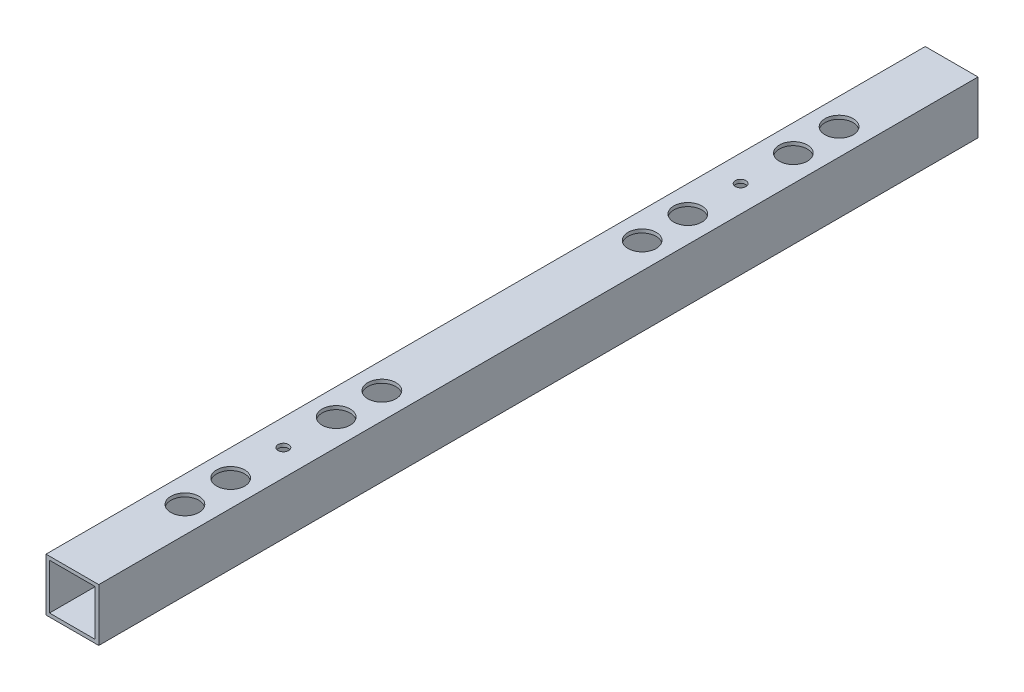
ISO-10303-21;
HEADER;
FILE_DESCRIPTION(('STEP AP214'),'2;1');
FILE_NAME('part.step','',(''),(''),'','','');
FILE_SCHEMA(('AUTOMOTIVE_DESIGN { 1 0 10303 214 1 1 1 1 }'));
ENDSEC;
DATA;
#1=APPLICATION_CONTEXT('core data for automotive mechanical design processes');
#2=APPLICATION_PROTOCOL_DEFINITION('international standard','automotive_design',2000,#1);
#3=PRODUCT_CONTEXT('',#1,'mechanical');
#4=PRODUCT('Part','Part','',(#3));
#5=PRODUCT_RELATED_PRODUCT_CATEGORY('part','',(#4));
#6=PRODUCT_DEFINITION_FORMATION('','',#4);
#7=PRODUCT_DEFINITION_CONTEXT('part definition',#1,'design');
#8=PRODUCT_DEFINITION('design','',#6,#7);
#9=PRODUCT_DEFINITION_SHAPE('','',#8);
#10=(LENGTH_UNIT() NAMED_UNIT(*) SI_UNIT(.MILLI.,.METRE.));
#11=(NAMED_UNIT(*) PLANE_ANGLE_UNIT() SI_UNIT($,.RADIAN.));
#12=(NAMED_UNIT(*) SI_UNIT($,.STERADIAN.) SOLID_ANGLE_UNIT());
#13=UNCERTAINTY_MEASURE_WITH_UNIT(LENGTH_MEASURE(1.E-05),#10,'distance_accuracy_value','');
#14=(GEOMETRIC_REPRESENTATION_CONTEXT(3) GLOBAL_UNCERTAINTY_ASSIGNED_CONTEXT((#13)) GLOBAL_UNIT_ASSIGNED_CONTEXT((#10,
#11,#12)) REPRESENTATION_CONTEXT('',''));
#15=CARTESIAN_POINT('',(0.,0.,0.));
#16=DIRECTION('',(0.,0.,1.));
#17=DIRECTION('',(1.,0.,0.));
#18=AXIS2_PLACEMENT_3D('',#15,#16,#17);
#19=CARTESIAN_POINT('',(0.,0.,250.));
#20=DIRECTION('',(0.,0.,-1.));
#21=DIRECTION('',(-1.,0.,0.));
#22=AXIS2_PLACEMENT_3D('',#19,#20,#21);
#23=PLANE('',#22);
#24=DIRECTION('',(0.,1.,0.));
#25=VECTOR('',#24,1.);
#26=CARTESIAN_POINT('',(7.5,-7.5,250.));
#27=LINE('',#26,#25);
#28=CARTESIAN_POINT('',(7.5,-7.5,250.));
#29=VERTEX_POINT('',#28);
#30=CARTESIAN_POINT('',(7.5,7.5,250.));
#31=VERTEX_POINT('',#30);
#32=EDGE_CURVE('E142',#29,#31,#27,.T.);
#33=ORIENTED_EDGE('',*,*,#32,.T.);
#34=DIRECTION('',(-1.,0.,0.));
#35=VECTOR('',#34,1.);
#36=CARTESIAN_POINT('',(-7.5,7.5,250.));
#37=LINE('',#36,#35);
#38=CARTESIAN_POINT('',(-7.5,7.5,250.));
#39=VERTEX_POINT('',#38);
#40=EDGE_CURVE('E145',#31,#39,#37,.T.);
#41=ORIENTED_EDGE('',*,*,#40,.T.);
#42=DIRECTION('',(0.,-1.,0.));
#43=VECTOR('',#42,1.);
#44=CARTESIAN_POINT('',(-7.5,-7.5,250.));
#45=LINE('',#44,#43);
#46=CARTESIAN_POINT('',(-7.5,-7.5,250.));
#47=VERTEX_POINT('',#46);
#48=EDGE_CURVE('E148',#39,#47,#45,.T.);
#49=ORIENTED_EDGE('',*,*,#48,.T.);
#50=DIRECTION('',(1.,0.,0.));
#51=VECTOR('',#50,1.);
#52=CARTESIAN_POINT('',(-7.5,-7.5,250.));
#53=LINE('',#52,#51);
#54=EDGE_CURVE('E150',#47,#29,#53,.T.);
#55=ORIENTED_EDGE('',*,*,#54,.T.);
#56=EDGE_LOOP('',(#33,#41,#49,#55));
#57=FACE_BOUND('',#56,.T.);
#58=DIRECTION('',(0.,-1.,0.));
#59=VECTOR('',#58,1.);
#60=CARTESIAN_POINT('',(-6.5,-6.5,250.));
#61=LINE('',#60,#59);
#62=CARTESIAN_POINT('',(-6.5,6.5,250.));
#63=VERTEX_POINT('',#62);
#64=CARTESIAN_POINT('',(-6.5,-6.5,250.));
#65=VERTEX_POINT('',#64);
#66=EDGE_CURVE('E104',#63,#65,#61,.T.);
#67=ORIENTED_EDGE('',*,*,#66,.F.);
#68=DIRECTION('',(-1.,0.,0.));
#69=VECTOR('',#68,1.);
#70=CARTESIAN_POINT('',(-6.5,6.5,250.));
#71=LINE('',#70,#69);
#72=CARTESIAN_POINT('',(6.5,6.5,250.));
#73=VERTEX_POINT('',#72);
#74=EDGE_CURVE('E126',#73,#63,#71,.T.);
#75=ORIENTED_EDGE('',*,*,#74,.F.);
#76=DIRECTION('',(0.,1.,0.));
#77=VECTOR('',#76,1.);
#78=CARTESIAN_POINT('',(6.5,-6.5,250.));
#79=LINE('',#78,#77);
#80=CARTESIAN_POINT('',(6.5,-6.5,250.));
#81=VERTEX_POINT('',#80);
#82=EDGE_CURVE('E124',#81,#73,#79,.T.);
#83=ORIENTED_EDGE('',*,*,#82,.F.);
#84=DIRECTION('',(1.,0.,0.));
#85=VECTOR('',#84,1.);
#86=CARTESIAN_POINT('',(-6.5,-6.5,250.));
#87=LINE('',#86,#85);
#88=EDGE_CURVE('E112',#65,#81,#87,.T.);
#89=ORIENTED_EDGE('',*,*,#88,.F.);
#90=EDGE_LOOP('',(#67,#75,#83,#89));
#91=FACE_BOUND('',#90,.T.);
#92=ADVANCED_FACE('F37',(#57,#91),#23,.F.);
#93=CARTESIAN_POINT('',(0.,0.,0.));
#94=DIRECTION('',(0.,0.,-1.));
#95=DIRECTION('',(-1.,0.,0.));
#96=AXIS2_PLACEMENT_3D('',#93,#94,#95);
#97=PLANE('',#96);
#98=DIRECTION('',(0.,1.,0.));
#99=VECTOR('',#98,1.);
#100=CARTESIAN_POINT('',(7.5,-7.5,0.));
#101=LINE('',#100,#99);
#102=CARTESIAN_POINT('',(7.5,-7.5,0.));
#103=VERTEX_POINT('',#102);
#104=CARTESIAN_POINT('',(7.5,7.5,0.));
#105=VERTEX_POINT('',#104);
#106=EDGE_CURVE('E120',#103,#105,#101,.T.);
#107=ORIENTED_EDGE('',*,*,#106,.F.);
#108=DIRECTION('',(1.,0.,0.));
#109=VECTOR('',#108,1.);
#110=CARTESIAN_POINT('',(-7.5,-7.5,0.));
#111=LINE('',#110,#109);
#112=CARTESIAN_POINT('',(-7.5,-7.5,0.));
#113=VERTEX_POINT('',#112);
#114=EDGE_CURVE('E146',#113,#103,#111,.T.);
#115=ORIENTED_EDGE('',*,*,#114,.F.);
#116=DIRECTION('',(0.,-1.,0.));
#117=VECTOR('',#116,1.);
#118=CARTESIAN_POINT('',(-7.5,-7.5,0.));
#119=LINE('',#118,#117);
#120=CARTESIAN_POINT('',(-7.5,7.5,0.));
#121=VERTEX_POINT('',#120);
#122=EDGE_CURVE('E157',#121,#113,#119,.T.);
#123=ORIENTED_EDGE('',*,*,#122,.F.);
#124=DIRECTION('',(-1.,0.,0.));
#125=VECTOR('',#124,1.);
#126=CARTESIAN_POINT('',(-7.5,7.5,0.));
#127=LINE('',#126,#125);
#128=EDGE_CURVE('E155',#105,#121,#127,.T.);
#129=ORIENTED_EDGE('',*,*,#128,.F.);
#130=EDGE_LOOP('',(#107,#115,#123,#129));
#131=FACE_BOUND('',#130,.T.);
#132=DIRECTION('',(-1.,0.,0.));
#133=VECTOR('',#132,1.);
#134=CARTESIAN_POINT('',(-6.5,6.5,0.));
#135=LINE('',#134,#133);
#136=CARTESIAN_POINT('',(6.5,6.5,0.));
#137=VERTEX_POINT('',#136);
#138=CARTESIAN_POINT('',(-6.5,6.5,0.));
#139=VERTEX_POINT('',#138);
#140=EDGE_CURVE('E113',#137,#139,#135,.T.);
#141=ORIENTED_EDGE('',*,*,#140,.T.);
#142=DIRECTION('',(0.,-1.,0.));
#143=VECTOR('',#142,1.);
#144=CARTESIAN_POINT('',(-6.5,-6.5,0.));
#145=LINE('',#144,#143);
#146=CARTESIAN_POINT('',(-6.5,-6.5,0.));
#147=VERTEX_POINT('',#146);
#148=EDGE_CURVE('E62',#139,#147,#145,.T.);
#149=ORIENTED_EDGE('',*,*,#148,.T.);
#150=DIRECTION('',(1.,0.,0.));
#151=VECTOR('',#150,1.);
#152=CARTESIAN_POINT('',(-6.5,-6.5,0.));
#153=LINE('',#152,#151);
#154=CARTESIAN_POINT('',(6.5,-6.5,0.));
#155=VERTEX_POINT('',#154);
#156=EDGE_CURVE('E119',#147,#155,#153,.T.);
#157=ORIENTED_EDGE('',*,*,#156,.T.);
#158=DIRECTION('',(0.,1.,0.));
#159=VECTOR('',#158,1.);
#160=CARTESIAN_POINT('',(6.5,-6.5,0.));
#161=LINE('',#160,#159);
#162=EDGE_CURVE('E134',#155,#137,#161,.T.);
#163=ORIENTED_EDGE('',*,*,#162,.T.);
#164=EDGE_LOOP('',(#141,#149,#157,#163));
#165=FACE_BOUND('',#164,.T.);
#166=ADVANCED_FACE('F307',(#131,#165),#97,.T.);
#167=CARTESIAN_POINT('',(7.5,-7.5,250.));
#168=DIRECTION('',(-1.,0.,0.));
#169=DIRECTION('',(0.,0.,1.));
#170=AXIS2_PLACEMENT_3D('',#167,#168,#169);
#171=PLANE('',#170);
#172=ORIENTED_EDGE('',*,*,#106,.T.);
#173=DIRECTION('',(0.,0.,-1.));
#174=VECTOR('',#173,1.);
#175=CARTESIAN_POINT('',(7.5,7.5,250.));
#176=LINE('',#175,#174);
#177=EDGE_CURVE('E11',#31,#105,#176,.T.);
#178=ORIENTED_EDGE('',*,*,#177,.F.);
#179=ORIENTED_EDGE('',*,*,#32,.F.);
#180=DIRECTION('',(0.,0.,-1.));
#181=VECTOR('',#180,1.);
#182=CARTESIAN_POINT('',(7.5,-7.5,250.));
#183=LINE('',#182,#181);
#184=EDGE_CURVE('E152',#29,#103,#183,.T.);
#185=ORIENTED_EDGE('',*,*,#184,.T.);
#186=EDGE_LOOP('',(#172,#178,#179,#185));
#187=FACE_BOUND('',#186,.T.);
#188=ADVANCED_FACE('F39',(#187),#171,.F.);
#189=CARTESIAN_POINT('',(-7.5,7.5,250.));
#190=DIRECTION('',(0.,-1.,0.));
#191=DIRECTION('',(0.,0.,-1.));
#192=AXIS2_PLACEMENT_3D('',#189,#190,#191);
#193=PLANE('',#192);
#194=CARTESIAN_POINT('',(0.,7.5,205.));
#195=DIRECTION('',(0.,1.,0.));
#196=DIRECTION('',(0.,0.,1.));
#197=AXIS2_PLACEMENT_3D('',#194,#195,#196);
#198=CIRCLE('',#197,4.);
#199=CARTESIAN_POINT('',(0.,7.5,209.));
#200=VERTEX_POINT('',#199);
#201=EDGE_CURVE('E186',#200,#200,#198,.T.);
#202=ORIENTED_EDGE('',*,*,#201,.F.);
#203=EDGE_LOOP('',(#202));
#204=FACE_BOUND('',#203,.T.);
#205=CARTESIAN_POINT('',(0.,7.5,162.));
#206=DIRECTION('',(0.,1.,0.));
#207=DIRECTION('',(0.,0.,1.));
#208=AXIS2_PLACEMENT_3D('',#205,#206,#207);
#209=CIRCLE('',#208,4.);
#210=CARTESIAN_POINT('',(0.,7.5,166.));
#211=VERTEX_POINT('',#210);
#212=EDGE_CURVE('E222',#211,#211,#209,.T.);
#213=ORIENTED_EDGE('',*,*,#212,.F.);
#214=EDGE_LOOP('',(#213));
#215=FACE_BOUND('',#214,.T.);
#216=CARTESIAN_POINT('',(0.,7.5,175.));
#217=DIRECTION('',(0.,1.,0.));
#218=DIRECTION('',(0.,0.,1.));
#219=AXIS2_PLACEMENT_3D('',#216,#217,#218);
#220=CIRCLE('',#219,4.);
#221=CARTESIAN_POINT('',(0.,7.5,179.));
#222=VERTEX_POINT('',#221);
#223=EDGE_CURVE('E225',#222,#222,#220,.T.);
#224=ORIENTED_EDGE('',*,*,#223,.F.);
#225=EDGE_LOOP('',(#224));
#226=FACE_BOUND('',#225,.T.);
#227=CARTESIAN_POINT('',(0.,7.5,75.));
#228=DIRECTION('',(0.,1.,0.));
#229=DIRECTION('',(0.,0.,-1.));
#230=AXIS2_PLACEMENT_3D('',#227,#228,#229);
#231=CIRCLE('',#230,4.);
#232=CARTESIAN_POINT('',(0.,7.5,71.));
#233=VERTEX_POINT('',#232);
#234=EDGE_CURVE('E228',#233,#233,#231,.T.);
#235=ORIENTED_EDGE('',*,*,#234,.F.);
#236=EDGE_LOOP('',(#235));
#237=FACE_BOUND('',#236,.T.);
#238=CARTESIAN_POINT('',(0.,7.5,88.));
#239=DIRECTION('',(0.,1.,0.));
#240=DIRECTION('',(0.,0.,-1.));
#241=AXIS2_PLACEMENT_3D('',#238,#239,#240);
#242=CIRCLE('',#241,4.);
#243=CARTESIAN_POINT('',(0.,7.5,84.));
#244=VERTEX_POINT('',#243);
#245=EDGE_CURVE('E231',#244,#244,#242,.T.);
#246=ORIENTED_EDGE('',*,*,#245,.F.);
#247=EDGE_LOOP('',(#246));
#248=FACE_BOUND('',#247,.T.);
#249=CARTESIAN_POINT('',(0.,7.5,45.));
#250=DIRECTION('',(0.,1.,0.));
#251=DIRECTION('',(0.,0.,-1.));
#252=AXIS2_PLACEMENT_3D('',#249,#250,#251);
#253=CIRCLE('',#252,4.);
#254=CARTESIAN_POINT('',(0.,7.5,41.));
#255=VERTEX_POINT('',#254);
#256=EDGE_CURVE('E210',#255,#255,#253,.T.);
#257=ORIENTED_EDGE('',*,*,#256,.F.);
#258=EDGE_LOOP('',(#257));
#259=FACE_BOUND('',#258,.T.);
#260=CARTESIAN_POINT('',(0.,7.5,32.));
#261=DIRECTION('',(0.,1.,0.));
#262=DIRECTION('',(0.,0.,-1.));
#263=AXIS2_PLACEMENT_3D('',#260,#261,#262);
#264=CIRCLE('',#263,4.);
#265=CARTESIAN_POINT('',(0.,7.5,28.));
#266=VERTEX_POINT('',#265);
#267=EDGE_CURVE('E205',#266,#266,#264,.T.);
#268=ORIENTED_EDGE('',*,*,#267,.F.);
#269=EDGE_LOOP('',(#268));
#270=FACE_BOUND('',#269,.T.);
#271=CARTESIAN_POINT('',(0.,7.5,218.));
#272=DIRECTION('',(0.,1.,0.));
#273=DIRECTION('',(0.,0.,1.));
#274=AXIS2_PLACEMENT_3D('',#271,#272,#273);
#275=CIRCLE('',#274,4.);
#276=CARTESIAN_POINT('',(0.,7.5,222.));
#277=VERTEX_POINT('',#276);
#278=EDGE_CURVE('E181',#277,#277,#275,.T.);
#279=ORIENTED_EDGE('',*,*,#278,.F.);
#280=EDGE_LOOP('',(#279));
#281=FACE_BOUND('',#280,.T.);
#282=CARTESIAN_POINT('',(0.,7.5,190.));
#283=DIRECTION('',(0.,1.,0.));
#284=DIRECTION('',(0.,0.,1.));
#285=AXIS2_PLACEMENT_3D('',#282,#283,#284);
#286=CIRCLE('',#285,1.5);
#287=CARTESIAN_POINT('',(0.,7.5,191.5));
#288=VERTEX_POINT('',#287);
#289=EDGE_CURVE('E171',#288,#288,#286,.T.);
#290=ORIENTED_EDGE('',*,*,#289,.F.);
#291=EDGE_LOOP('',(#290));
#292=FACE_BOUND('',#291,.T.);
#293=CARTESIAN_POINT('',(0.,7.5,60.));
#294=DIRECTION('',(0.,1.,0.));
#295=DIRECTION('',(0.,0.,-1.));
#296=AXIS2_PLACEMENT_3D('',#293,#294,#295);
#297=CIRCLE('',#296,1.5);
#298=CARTESIAN_POINT('',(0.,7.5,58.5));
#299=VERTEX_POINT('',#298);
#300=EDGE_CURVE('E180',#299,#299,#297,.T.);
#301=ORIENTED_EDGE('',*,*,#300,.F.);
#302=EDGE_LOOP('',(#301));
#303=FACE_BOUND('',#302,.T.);
#304=ORIENTED_EDGE('',*,*,#128,.T.);
#305=DIRECTION('',(0.,0.,-1.));
#306=VECTOR('',#305,1.);
#307=CARTESIAN_POINT('',(-7.5,7.5,250.));
#308=LINE('',#307,#306);
#309=EDGE_CURVE('E46',#39,#121,#308,.T.);
#310=ORIENTED_EDGE('',*,*,#309,.F.);
#311=ORIENTED_EDGE('',*,*,#40,.F.);
#312=ORIENTED_EDGE('',*,*,#177,.T.);
#313=EDGE_LOOP('',(#304,#310,#311,#312));
#314=FACE_BOUND('',#313,.T.);
#315=ADVANCED_FACE('F323',(#204,#215,#226,#237,#248,#259,#270,#281,#292,#303,#314),#193,.F.);
#316=CARTESIAN_POINT('',(-7.5,-7.5,250.));
#317=DIRECTION('',(1.,0.,0.));
#318=DIRECTION('',(0.,0.,-1.));
#319=AXIS2_PLACEMENT_3D('',#316,#317,#318);
#320=PLANE('',#319);
#321=ORIENTED_EDGE('',*,*,#122,.T.);
#322=DIRECTION('',(0.,0.,-1.));
#323=VECTOR('',#322,1.);
#324=CARTESIAN_POINT('',(-7.5,-7.5,250.));
#325=LINE('',#324,#323);
#326=EDGE_CURVE('E162',#47,#113,#325,.T.);
#327=ORIENTED_EDGE('',*,*,#326,.F.);
#328=ORIENTED_EDGE('',*,*,#48,.F.);
#329=ORIENTED_EDGE('',*,*,#309,.T.);
#330=EDGE_LOOP('',(#321,#327,#328,#329));
#331=FACE_BOUND('',#330,.T.);
#332=ADVANCED_FACE('F320',(#331),#320,.F.);
#333=CARTESIAN_POINT('',(-7.5,-7.5,250.));
#334=DIRECTION('',(0.,1.,0.));
#335=DIRECTION('',(0.,0.,1.));
#336=AXIS2_PLACEMENT_3D('',#333,#334,#335);
#337=PLANE('',#336);
#338=CARTESIAN_POINT('',(0.,-7.5,190.));
#339=DIRECTION('',(0.,-1.,0.));
#340=DIRECTION('',(0.,0.,-1.));
#341=AXIS2_PLACEMENT_3D('',#338,#339,#340);
#342=CIRCLE('',#341,4.);
#343=CARTESIAN_POINT('',(0.,-7.5,186.));
#344=VERTEX_POINT('',#343);
#345=EDGE_CURVE('E217',#344,#344,#342,.T.);
#346=ORIENTED_EDGE('',*,*,#345,.F.);
#347=EDGE_LOOP('',(#346));
#348=FACE_BOUND('',#347,.T.);
#349=CARTESIAN_POINT('',(0.,-7.5,60.));
#350=DIRECTION('',(0.,-1.,0.));
#351=DIRECTION('',(0.,0.,-1.));
#352=AXIS2_PLACEMENT_3D('',#349,#350,#351);
#353=CIRCLE('',#352,4.);
#354=CARTESIAN_POINT('',(0.,-7.5,56.));
#355=VERTEX_POINT('',#354);
#356=EDGE_CURVE('E206',#355,#355,#353,.T.);
#357=ORIENTED_EDGE('',*,*,#356,.F.);
#358=EDGE_LOOP('',(#357));
#359=FACE_BOUND('',#358,.T.);
#360=CARTESIAN_POINT('',(0.,-7.50000000000001,162.));
#361=DIRECTION('',(0.,1.,0.));
#362=DIRECTION('',(0.,0.,1.));
#363=AXIS2_PLACEMENT_3D('',#360,#361,#362);
#364=CIRCLE('',#363,1.5);
#365=CARTESIAN_POINT('',(0.,-7.50000000000001,163.5));
#366=VERTEX_POINT('',#365);
#367=EDGE_CURVE('E176',#366,#366,#364,.T.);
#368=ORIENTED_EDGE('',*,*,#367,.T.);
#369=EDGE_LOOP('',(#368));
#370=FACE_BOUND('',#369,.T.);
#371=CARTESIAN_POINT('',(0.,-7.50000000000001,175.));
#372=DIRECTION('',(0.,1.,0.));
#373=DIRECTION('',(0.,0.,1.));
#374=AXIS2_PLACEMENT_3D('',#371,#372,#373);
#375=CIRCLE('',#374,1.5);
#376=CARTESIAN_POINT('',(0.,-7.50000000000001,176.5));
#377=VERTEX_POINT('',#376);
#378=EDGE_CURVE('E274',#377,#377,#375,.T.);
#379=ORIENTED_EDGE('',*,*,#378,.T.);
#380=EDGE_LOOP('',(#379));
#381=FACE_BOUND('',#380,.T.);
#382=CARTESIAN_POINT('',(0.,-7.50000000000001,205.));
#383=DIRECTION('',(0.,1.,0.));
#384=DIRECTION('',(0.,0.,1.));
#385=AXIS2_PLACEMENT_3D('',#382,#383,#384);
#386=CIRCLE('',#385,1.5);
#387=CARTESIAN_POINT('',(0.,-7.50000000000001,206.5));
#388=VERTEX_POINT('',#387);
#389=EDGE_CURVE('E268',#388,#388,#386,.T.);
#390=ORIENTED_EDGE('',*,*,#389,.T.);
#391=EDGE_LOOP('',(#390));
#392=FACE_BOUND('',#391,.T.);
#393=CARTESIAN_POINT('',(0.,-7.50000000000001,32.));
#394=DIRECTION('',(0.,1.,0.));
#395=DIRECTION('',(0.,0.,1.));
#396=AXIS2_PLACEMENT_3D('',#393,#394,#395);
#397=CIRCLE('',#396,1.5);
#398=CARTESIAN_POINT('',(0.,-7.50000000000001,33.5));
#399=VERTEX_POINT('',#398);
#400=EDGE_CURVE('E262',#399,#399,#397,.T.);
#401=ORIENTED_EDGE('',*,*,#400,.T.);
#402=EDGE_LOOP('',(#401));
#403=FACE_BOUND('',#402,.T.);
#404=CARTESIAN_POINT('',(0.,-7.50000000000001,45.));
#405=DIRECTION('',(0.,1.,0.));
#406=DIRECTION('',(0.,0.,1.));
#407=AXIS2_PLACEMENT_3D('',#404,#405,#406);
#408=CIRCLE('',#407,1.5);
#409=CARTESIAN_POINT('',(0.,-7.50000000000001,46.5));
#410=VERTEX_POINT('',#409);
#411=EDGE_CURVE('E256',#410,#410,#408,.T.);
#412=ORIENTED_EDGE('',*,*,#411,.T.);
#413=EDGE_LOOP('',(#412));
#414=FACE_BOUND('',#413,.T.);
#415=CARTESIAN_POINT('',(0.,-7.50000000000001,75.));
#416=DIRECTION('',(0.,1.,0.));
#417=DIRECTION('',(0.,0.,1.));
#418=AXIS2_PLACEMENT_3D('',#415,#416,#417);
#419=CIRCLE('',#418,1.5);
#420=CARTESIAN_POINT('',(0.,-7.50000000000001,76.5));
#421=VERTEX_POINT('',#420);
#422=EDGE_CURVE('E250',#421,#421,#419,.T.);
#423=ORIENTED_EDGE('',*,*,#422,.T.);
#424=EDGE_LOOP('',(#423));
#425=FACE_BOUND('',#424,.T.);
#426=CARTESIAN_POINT('',(0.,-7.50000000000001,88.));
#427=DIRECTION('',(0.,1.,0.));
#428=DIRECTION('',(0.,0.,1.));
#429=AXIS2_PLACEMENT_3D('',#426,#427,#428);
#430=CIRCLE('',#429,1.5);
#431=CARTESIAN_POINT('',(0.,-7.50000000000001,89.5));
#432=VERTEX_POINT('',#431);
#433=EDGE_CURVE('E244',#432,#432,#430,.T.);
#434=ORIENTED_EDGE('',*,*,#433,.T.);
#435=EDGE_LOOP('',(#434));
#436=FACE_BOUND('',#435,.T.);
#437=CARTESIAN_POINT('',(0.,-7.50000000000001,218.));
#438=DIRECTION('',(0.,1.,0.));
#439=DIRECTION('',(0.,0.,1.));
#440=AXIS2_PLACEMENT_3D('',#437,#438,#439);
#441=CIRCLE('',#440,1.5);
#442=CARTESIAN_POINT('',(0.,-7.50000000000001,219.5));
#443=VERTEX_POINT('',#442);
#444=EDGE_CURVE('E132',#443,#443,#441,.T.);
#445=ORIENTED_EDGE('',*,*,#444,.T.);
#446=EDGE_LOOP('',(#445));
#447=FACE_BOUND('',#446,.T.);
#448=ORIENTED_EDGE('',*,*,#114,.T.);
#449=ORIENTED_EDGE('',*,*,#184,.F.);
#450=ORIENTED_EDGE('',*,*,#54,.F.);
#451=ORIENTED_EDGE('',*,*,#326,.T.);
#452=EDGE_LOOP('',(#448,#449,#450,#451));
#453=FACE_BOUND('',#452,.T.);
#454=ADVANCED_FACE('F286',(#348,#359,#370,#381,#392,#403,#414,#425,#436,#447,#453),#337,.F.);
#455=CARTESIAN_POINT('',(-6.5,-6.5,250.));
#456=DIRECTION('',(1.,0.,0.));
#457=DIRECTION('',(0.,0.,-1.));
#458=AXIS2_PLACEMENT_3D('',#455,#456,#457);
#459=PLANE('',#458);
#460=ORIENTED_EDGE('',*,*,#148,.F.);
#461=DIRECTION('',(0.,0.,-1.));
#462=VECTOR('',#461,1.);
#463=CARTESIAN_POINT('',(-6.5,6.5,250.));
#464=LINE('',#463,#462);
#465=EDGE_CURVE('E108',#63,#139,#464,.T.);
#466=ORIENTED_EDGE('',*,*,#465,.F.);
#467=ORIENTED_EDGE('',*,*,#66,.T.);
#468=DIRECTION('',(0.,0.,-1.));
#469=VECTOR('',#468,1.);
#470=CARTESIAN_POINT('',(-6.5,-6.5,250.));
#471=LINE('',#470,#469);
#472=EDGE_CURVE('E107',#65,#147,#471,.T.);
#473=ORIENTED_EDGE('',*,*,#472,.T.);
#474=EDGE_LOOP('',(#460,#466,#467,#473));
#475=FACE_BOUND('',#474,.T.);
#476=ADVANCED_FACE('F106',(#475),#459,.T.);
#477=CARTESIAN_POINT('',(-6.5,-6.5,250.));
#478=DIRECTION('',(0.,1.,0.));
#479=DIRECTION('',(0.,0.,1.));
#480=AXIS2_PLACEMENT_3D('',#477,#478,#479);
#481=PLANE('',#480);
#482=CARTESIAN_POINT('',(0.,-6.5,190.));
#483=DIRECTION('',(0.,1.,0.));
#484=DIRECTION('',(0.,0.,1.));
#485=AXIS2_PLACEMENT_3D('',#482,#483,#484);
#486=CIRCLE('',#485,4.);
#487=CARTESIAN_POINT('',(0.,-6.5,194.));
#488=VERTEX_POINT('',#487);
#489=EDGE_CURVE('E41',#488,#488,#486,.T.);
#490=ORIENTED_EDGE('',*,*,#489,.F.);
#491=EDGE_LOOP('',(#490));
#492=FACE_BOUND('',#491,.T.);
#493=CARTESIAN_POINT('',(0.,-6.5,60.));
#494=DIRECTION('',(0.,1.,0.));
#495=DIRECTION('',(0.,0.,1.));
#496=AXIS2_PLACEMENT_3D('',#493,#494,#495);
#497=CIRCLE('',#496,4.);
#498=CARTESIAN_POINT('',(0.,-6.5,64.));
#499=VERTEX_POINT('',#498);
#500=EDGE_CURVE('E203',#499,#499,#497,.T.);
#501=ORIENTED_EDGE('',*,*,#500,.F.);
#502=EDGE_LOOP('',(#501));
#503=FACE_BOUND('',#502,.T.);
#504=CARTESIAN_POINT('',(0.,-6.50000000000001,162.));
#505=DIRECTION('',(0.,1.,0.));
#506=DIRECTION('',(0.,0.,1.));
#507=AXIS2_PLACEMENT_3D('',#504,#505,#506);
#508=CIRCLE('',#507,1.5);
#509=CARTESIAN_POINT('',(0.,-6.50000000000001,163.5));
#510=VERTEX_POINT('',#509);
#511=EDGE_CURVE('E277',#510,#510,#508,.T.);
#512=ORIENTED_EDGE('',*,*,#511,.F.);
#513=EDGE_LOOP('',(#512));
#514=FACE_BOUND('',#513,.T.);
#515=CARTESIAN_POINT('',(0.,-6.50000000000001,175.));
#516=DIRECTION('',(0.,1.,0.));
#517=DIRECTION('',(0.,0.,1.));
#518=AXIS2_PLACEMENT_3D('',#515,#516,#517);
#519=CIRCLE('',#518,1.5);
#520=CARTESIAN_POINT('',(0.,-6.50000000000001,176.5));
#521=VERTEX_POINT('',#520);
#522=EDGE_CURVE('E271',#521,#521,#519,.T.);
#523=ORIENTED_EDGE('',*,*,#522,.F.);
#524=EDGE_LOOP('',(#523));
#525=FACE_BOUND('',#524,.T.);
#526=CARTESIAN_POINT('',(0.,-6.50000000000001,205.));
#527=DIRECTION('',(0.,1.,0.));
#528=DIRECTION('',(0.,0.,1.));
#529=AXIS2_PLACEMENT_3D('',#526,#527,#528);
#530=CIRCLE('',#529,1.5);
#531=CARTESIAN_POINT('',(0.,-6.50000000000001,206.5));
#532=VERTEX_POINT('',#531);
#533=EDGE_CURVE('E265',#532,#532,#530,.T.);
#534=ORIENTED_EDGE('',*,*,#533,.F.);
#535=EDGE_LOOP('',(#534));
#536=FACE_BOUND('',#535,.T.);
#537=CARTESIAN_POINT('',(0.,-6.50000000000001,32.));
#538=DIRECTION('',(0.,1.,0.));
#539=DIRECTION('',(0.,0.,1.));
#540=AXIS2_PLACEMENT_3D('',#537,#538,#539);
#541=CIRCLE('',#540,1.5);
#542=CARTESIAN_POINT('',(0.,-6.50000000000001,33.5));
#543=VERTEX_POINT('',#542);
#544=EDGE_CURVE('E259',#543,#543,#541,.T.);
#545=ORIENTED_EDGE('',*,*,#544,.F.);
#546=EDGE_LOOP('',(#545));
#547=FACE_BOUND('',#546,.T.);
#548=CARTESIAN_POINT('',(0.,-6.50000000000001,45.));
#549=DIRECTION('',(0.,1.,0.));
#550=DIRECTION('',(0.,0.,1.));
#551=AXIS2_PLACEMENT_3D('',#548,#549,#550);
#552=CIRCLE('',#551,1.5);
#553=CARTESIAN_POINT('',(0.,-6.50000000000001,46.5));
#554=VERTEX_POINT('',#553);
#555=EDGE_CURVE('E253',#554,#554,#552,.T.);
#556=ORIENTED_EDGE('',*,*,#555,.F.);
#557=EDGE_LOOP('',(#556));
#558=FACE_BOUND('',#557,.T.);
#559=CARTESIAN_POINT('',(0.,-6.50000000000001,75.));
#560=DIRECTION('',(0.,1.,0.));
#561=DIRECTION('',(0.,0.,1.));
#562=AXIS2_PLACEMENT_3D('',#559,#560,#561);
#563=CIRCLE('',#562,1.5);
#564=CARTESIAN_POINT('',(0.,-6.50000000000001,76.5));
#565=VERTEX_POINT('',#564);
#566=EDGE_CURVE('E247',#565,#565,#563,.T.);
#567=ORIENTED_EDGE('',*,*,#566,.F.);
#568=EDGE_LOOP('',(#567));
#569=FACE_BOUND('',#568,.T.);
#570=CARTESIAN_POINT('',(0.,-6.50000000000001,88.));
#571=DIRECTION('',(0.,1.,0.));
#572=DIRECTION('',(0.,0.,1.));
#573=AXIS2_PLACEMENT_3D('',#570,#571,#572);
#574=CIRCLE('',#573,1.5);
#575=CARTESIAN_POINT('',(0.,-6.50000000000001,89.5));
#576=VERTEX_POINT('',#575);
#577=EDGE_CURVE('E170',#576,#576,#574,.T.);
#578=ORIENTED_EDGE('',*,*,#577,.F.);
#579=EDGE_LOOP('',(#578));
#580=FACE_BOUND('',#579,.T.);
#581=CARTESIAN_POINT('',(0.,-6.50000000000001,218.));
#582=DIRECTION('',(0.,1.,0.));
#583=DIRECTION('',(0.,0.,1.));
#584=AXIS2_PLACEMENT_3D('',#581,#582,#583);
#585=CIRCLE('',#584,1.5);
#586=CARTESIAN_POINT('',(0.,-6.50000000000001,219.5));
#587=VERTEX_POINT('',#586);
#588=EDGE_CURVE('E175',#587,#587,#585,.T.);
#589=ORIENTED_EDGE('',*,*,#588,.F.);
#590=EDGE_LOOP('',(#589));
#591=FACE_BOUND('',#590,.T.);
#592=ORIENTED_EDGE('',*,*,#156,.F.);
#593=ORIENTED_EDGE('',*,*,#472,.F.);
#594=ORIENTED_EDGE('',*,*,#88,.T.);
#595=DIRECTION('',(0.,0.,-1.));
#596=VECTOR('',#595,1.);
#597=CARTESIAN_POINT('',(6.5,-6.5,250.));
#598=LINE('',#597,#596);
#599=EDGE_CURVE('E121',#81,#155,#598,.T.);
#600=ORIENTED_EDGE('',*,*,#599,.T.);
#601=EDGE_LOOP('',(#592,#593,#594,#600));
#602=FACE_BOUND('',#601,.T.);
#603=ADVANCED_FACE('F116',(#492,#503,#514,#525,#536,#547,#558,#569,#580,#591,#602),#481,.T.);
#604=CARTESIAN_POINT('',(6.5,-6.5,250.));
#605=DIRECTION('',(-1.,0.,0.));
#606=DIRECTION('',(0.,-1.,0.));
#607=AXIS2_PLACEMENT_3D('',#604,#605,#606);
#608=PLANE('',#607);
#609=ORIENTED_EDGE('',*,*,#162,.F.);
#610=ORIENTED_EDGE('',*,*,#599,.F.);
#611=ORIENTED_EDGE('',*,*,#82,.T.);
#612=DIRECTION('',(0.,0.,-1.));
#613=VECTOR('',#612,1.);
#614=CARTESIAN_POINT('',(6.5,6.5,250.));
#615=LINE('',#614,#613);
#616=EDGE_CURVE('E54',#73,#137,#615,.T.);
#617=ORIENTED_EDGE('',*,*,#616,.T.);
#618=EDGE_LOOP('',(#609,#610,#611,#617));
#619=FACE_BOUND('',#618,.T.);
#620=ADVANCED_FACE('F302',(#619),#608,.T.);
#621=CARTESIAN_POINT('',(-6.5,6.5,250.));
#622=DIRECTION('',(0.,-1.,0.));
#623=DIRECTION('',(1.,0.,0.));
#624=AXIS2_PLACEMENT_3D('',#621,#622,#623);
#625=PLANE('',#624);
#626=CARTESIAN_POINT('',(0.,6.5,205.));
#627=DIRECTION('',(0.,-1.,0.));
#628=DIRECTION('',(1.,0.,0.));
#629=AXIS2_PLACEMENT_3D('',#626,#627,#628);
#630=CIRCLE('',#629,4.);
#631=CARTESIAN_POINT('',(4.00000000000001,6.5,205.));
#632=VERTEX_POINT('',#631);
#633=EDGE_CURVE('E201',#632,#632,#630,.T.);
#634=ORIENTED_EDGE('',*,*,#633,.F.);
#635=EDGE_LOOP('',(#634));
#636=FACE_BOUND('',#635,.T.);
#637=CARTESIAN_POINT('',(0.,6.5,162.));
#638=DIRECTION('',(0.,-1.,0.));
#639=DIRECTION('',(1.,0.,0.));
#640=AXIS2_PLACEMENT_3D('',#637,#638,#639);
#641=CIRCLE('',#640,4.);
#642=CARTESIAN_POINT('',(4.00000000000001,6.5,162.));
#643=VERTEX_POINT('',#642);
#644=EDGE_CURVE('E198',#643,#643,#641,.T.);
#645=ORIENTED_EDGE('',*,*,#644,.F.);
#646=EDGE_LOOP('',(#645));
#647=FACE_BOUND('',#646,.T.);
#648=CARTESIAN_POINT('',(0.,6.5,175.));
#649=DIRECTION('',(0.,-1.,0.));
#650=DIRECTION('',(1.,0.,0.));
#651=AXIS2_PLACEMENT_3D('',#648,#649,#650);
#652=CIRCLE('',#651,4.);
#653=CARTESIAN_POINT('',(4.00000000000001,6.5,175.));
#654=VERTEX_POINT('',#653);
#655=EDGE_CURVE('E195',#654,#654,#652,.T.);
#656=ORIENTED_EDGE('',*,*,#655,.F.);
#657=EDGE_LOOP('',(#656));
#658=FACE_BOUND('',#657,.T.);
#659=CARTESIAN_POINT('',(0.,6.5,75.));
#660=DIRECTION('',(0.,-1.,0.));
#661=DIRECTION('',(1.,0.,0.));
#662=AXIS2_PLACEMENT_3D('',#659,#660,#661);
#663=CIRCLE('',#662,4.);
#664=CARTESIAN_POINT('',(4.00000000000001,6.5,75.));
#665=VERTEX_POINT('',#664);
#666=EDGE_CURVE('E192',#665,#665,#663,.T.);
#667=ORIENTED_EDGE('',*,*,#666,.F.);
#668=EDGE_LOOP('',(#667));
#669=FACE_BOUND('',#668,.T.);
#670=CARTESIAN_POINT('',(0.,6.5,88.));
#671=DIRECTION('',(0.,-1.,0.));
#672=DIRECTION('',(1.,0.,0.));
#673=AXIS2_PLACEMENT_3D('',#670,#671,#672);
#674=CIRCLE('',#673,4.);
#675=CARTESIAN_POINT('',(4.00000000000001,6.5,88.));
#676=VERTEX_POINT('',#675);
#677=EDGE_CURVE('E189',#676,#676,#674,.T.);
#678=ORIENTED_EDGE('',*,*,#677,.F.);
#679=EDGE_LOOP('',(#678));
#680=FACE_BOUND('',#679,.T.);
#681=CARTESIAN_POINT('',(0.,6.5,45.));
#682=DIRECTION('',(0.,-1.,0.));
#683=DIRECTION('',(1.,0.,0.));
#684=AXIS2_PLACEMENT_3D('',#681,#682,#683);
#685=CIRCLE('',#684,4.);
#686=CARTESIAN_POINT('',(4.00000000000001,6.5,45.));
#687=VERTEX_POINT('',#686);
#688=EDGE_CURVE('E185',#687,#687,#685,.T.);
#689=ORIENTED_EDGE('',*,*,#688,.F.);
#690=EDGE_LOOP('',(#689));
#691=FACE_BOUND('',#690,.T.);
#692=CARTESIAN_POINT('',(0.,6.5,32.));
#693=DIRECTION('',(0.,-1.,0.));
#694=DIRECTION('',(1.,0.,0.));
#695=AXIS2_PLACEMENT_3D('',#692,#693,#694);
#696=CIRCLE('',#695,4.);
#697=CARTESIAN_POINT('',(4.,6.5,32.));
#698=VERTEX_POINT('',#697);
#699=EDGE_CURVE('E182',#698,#698,#696,.T.);
#700=ORIENTED_EDGE('',*,*,#699,.F.);
#701=EDGE_LOOP('',(#700));
#702=FACE_BOUND('',#701,.T.);
#703=CARTESIAN_POINT('',(0.,6.5,218.));
#704=DIRECTION('',(0.,-1.,0.));
#705=DIRECTION('',(1.,0.,0.));
#706=AXIS2_PLACEMENT_3D('',#703,#704,#705);
#707=CIRCLE('',#706,4.);
#708=CARTESIAN_POINT('',(4.00000000000001,6.5,218.));
#709=VERTEX_POINT('',#708);
#710=EDGE_CURVE('E177',#709,#709,#707,.T.);
#711=ORIENTED_EDGE('',*,*,#710,.F.);
#712=EDGE_LOOP('',(#711));
#713=FACE_BOUND('',#712,.T.);
#714=CARTESIAN_POINT('',(0.,6.50000000000001,190.));
#715=DIRECTION('',(0.,-1.,0.));
#716=DIRECTION('',(1.,0.,0.));
#717=AXIS2_PLACEMENT_3D('',#714,#715,#716);
#718=CIRCLE('',#717,1.5);
#719=CARTESIAN_POINT('',(1.50000000000001,6.50000000000001,190.));
#720=VERTEX_POINT('',#719);
#721=EDGE_CURVE('E172',#720,#720,#718,.T.);
#722=ORIENTED_EDGE('',*,*,#721,.F.);
#723=EDGE_LOOP('',(#722));
#724=FACE_BOUND('',#723,.T.);
#725=CARTESIAN_POINT('',(0.,6.50000000000001,60.));
#726=DIRECTION('',(0.,-1.,0.));
#727=DIRECTION('',(1.,0.,0.));
#728=AXIS2_PLACEMENT_3D('',#725,#726,#727);
#729=CIRCLE('',#728,1.5);
#730=CARTESIAN_POINT('',(1.50000000000001,6.50000000000001,60.));
#731=VERTEX_POINT('',#730);
#732=EDGE_CURVE('E167',#731,#731,#729,.T.);
#733=ORIENTED_EDGE('',*,*,#732,.F.);
#734=EDGE_LOOP('',(#733));
#735=FACE_BOUND('',#734,.T.);
#736=ORIENTED_EDGE('',*,*,#140,.F.);
#737=ORIENTED_EDGE('',*,*,#616,.F.);
#738=ORIENTED_EDGE('',*,*,#74,.T.);
#739=ORIENTED_EDGE('',*,*,#465,.T.);
#740=EDGE_LOOP('',(#736,#737,#738,#739));
#741=FACE_BOUND('',#740,.T.);
#742=ADVANCED_FACE('F292',(#636,#647,#658,#669,#680,#691,#702,#713,#724,#735,#741),#625,.T.);
#743=CARTESIAN_POINT('',(0.,-242.5,218.));
#744=DIRECTION('',(0.,1.,0.));
#745=DIRECTION('',(0.,0.,1.));
#746=AXIS2_PLACEMENT_3D('',#743,#744,#745);
#747=CYLINDRICAL_SURFACE('',#746,1.5);
#748=ORIENTED_EDGE('',*,*,#588,.T.);
#749=EDGE_LOOP('',(#748));
#750=FACE_BOUND('',#749,.T.);
#751=ORIENTED_EDGE('',*,*,#444,.F.);
#752=EDGE_LOOP('',(#751));
#753=FACE_BOUND('',#752,.T.);
#754=ADVANCED_FACE('F289',(#750,#753),#747,.F.);
#755=CARTESIAN_POINT('',(0.,-242.5,60.));
#756=DIRECTION('',(0.,1.,0.));
#757=DIRECTION('',(0.,0.,1.));
#758=AXIS2_PLACEMENT_3D('',#755,#756,#757);
#759=CYLINDRICAL_SURFACE('',#758,1.5);
#760=ORIENTED_EDGE('',*,*,#732,.T.);
#761=EDGE_LOOP('',(#760));
#762=FACE_BOUND('',#761,.T.);
#763=ORIENTED_EDGE('',*,*,#300,.T.);
#764=EDGE_LOOP('',(#763));
#765=FACE_BOUND('',#764,.T.);
#766=ADVANCED_FACE('F291',(#762,#765),#759,.F.);
#767=CARTESIAN_POINT('',(0.,-242.5,190.));
#768=DIRECTION('',(0.,1.,0.));
#769=DIRECTION('',(0.,0.,1.));
#770=AXIS2_PLACEMENT_3D('',#767,#768,#769);
#771=CYLINDRICAL_SURFACE('',#770,1.5);
#772=ORIENTED_EDGE('',*,*,#721,.T.);
#773=EDGE_LOOP('',(#772));
#774=FACE_BOUND('',#773,.T.);
#775=ORIENTED_EDGE('',*,*,#289,.T.);
#776=EDGE_LOOP('',(#775));
#777=FACE_BOUND('',#776,.T.);
#778=ADVANCED_FACE('F299',(#774,#777),#771,.F.);
#779=CARTESIAN_POINT('',(0.,-242.5,88.));
#780=DIRECTION('',(0.,1.,0.));
#781=DIRECTION('',(0.,0.,1.));
#782=AXIS2_PLACEMENT_3D('',#779,#780,#781);
#783=CYLINDRICAL_SURFACE('',#782,1.5);
#784=ORIENTED_EDGE('',*,*,#577,.T.);
#785=EDGE_LOOP('',(#784));
#786=FACE_BOUND('',#785,.T.);
#787=ORIENTED_EDGE('',*,*,#433,.F.);
#788=EDGE_LOOP('',(#787));
#789=FACE_BOUND('',#788,.T.);
#790=ADVANCED_FACE('F392',(#786,#789),#783,.F.);
#791=CARTESIAN_POINT('',(0.,-242.5,75.));
#792=DIRECTION('',(0.,1.,0.));
#793=DIRECTION('',(0.,0.,1.));
#794=AXIS2_PLACEMENT_3D('',#791,#792,#793);
#795=CYLINDRICAL_SURFACE('',#794,1.5);
#796=ORIENTED_EDGE('',*,*,#566,.T.);
#797=EDGE_LOOP('',(#796));
#798=FACE_BOUND('',#797,.T.);
#799=ORIENTED_EDGE('',*,*,#422,.F.);
#800=EDGE_LOOP('',(#799));
#801=FACE_BOUND('',#800,.T.);
#802=ADVANCED_FACE('F395',(#798,#801),#795,.F.);
#803=CARTESIAN_POINT('',(0.,-242.5,45.));
#804=DIRECTION('',(0.,1.,0.));
#805=DIRECTION('',(0.,0.,1.));
#806=AXIS2_PLACEMENT_3D('',#803,#804,#805);
#807=CYLINDRICAL_SURFACE('',#806,1.5);
#808=ORIENTED_EDGE('',*,*,#555,.T.);
#809=EDGE_LOOP('',(#808));
#810=FACE_BOUND('',#809,.T.);
#811=ORIENTED_EDGE('',*,*,#411,.F.);
#812=EDGE_LOOP('',(#811));
#813=FACE_BOUND('',#812,.T.);
#814=ADVANCED_FACE('F402',(#810,#813),#807,.F.);
#815=CARTESIAN_POINT('',(0.,-242.5,32.));
#816=DIRECTION('',(0.,1.,0.));
#817=DIRECTION('',(0.,0.,1.));
#818=AXIS2_PLACEMENT_3D('',#815,#816,#817);
#819=CYLINDRICAL_SURFACE('',#818,1.5);
#820=ORIENTED_EDGE('',*,*,#544,.T.);
#821=EDGE_LOOP('',(#820));
#822=FACE_BOUND('',#821,.T.);
#823=ORIENTED_EDGE('',*,*,#400,.F.);
#824=EDGE_LOOP('',(#823));
#825=FACE_BOUND('',#824,.T.);
#826=ADVANCED_FACE('F408',(#822,#825),#819,.F.);
#827=CARTESIAN_POINT('',(0.,-242.5,205.));
#828=DIRECTION('',(0.,1.,0.));
#829=DIRECTION('',(0.,0.,1.));
#830=AXIS2_PLACEMENT_3D('',#827,#828,#829);
#831=CYLINDRICAL_SURFACE('',#830,1.5);
#832=ORIENTED_EDGE('',*,*,#533,.T.);
#833=EDGE_LOOP('',(#832));
#834=FACE_BOUND('',#833,.T.);
#835=ORIENTED_EDGE('',*,*,#389,.F.);
#836=EDGE_LOOP('',(#835));
#837=FACE_BOUND('',#836,.T.);
#838=ADVANCED_FACE('F411',(#834,#837),#831,.F.);
#839=CARTESIAN_POINT('',(0.,-242.5,175.));
#840=DIRECTION('',(0.,1.,0.));
#841=DIRECTION('',(0.,0.,1.));
#842=AXIS2_PLACEMENT_3D('',#839,#840,#841);
#843=CYLINDRICAL_SURFACE('',#842,1.5);
#844=ORIENTED_EDGE('',*,*,#522,.T.);
#845=EDGE_LOOP('',(#844));
#846=FACE_BOUND('',#845,.T.);
#847=ORIENTED_EDGE('',*,*,#378,.F.);
#848=EDGE_LOOP('',(#847));
#849=FACE_BOUND('',#848,.T.);
#850=ADVANCED_FACE('F416',(#846,#849),#843,.F.);
#851=CARTESIAN_POINT('',(0.,-242.5,162.));
#852=DIRECTION('',(0.,1.,0.));
#853=DIRECTION('',(0.,0.,1.));
#854=AXIS2_PLACEMENT_3D('',#851,#852,#853);
#855=CYLINDRICAL_SURFACE('',#854,1.5);
#856=ORIENTED_EDGE('',*,*,#511,.T.);
#857=EDGE_LOOP('',(#856));
#858=FACE_BOUND('',#857,.T.);
#859=ORIENTED_EDGE('',*,*,#367,.F.);
#860=EDGE_LOOP('',(#859));
#861=FACE_BOUND('',#860,.T.);
#862=ADVANCED_FACE('F419',(#858,#861),#855,.F.);
#863=CARTESIAN_POINT('',(0.,6.,218.));
#864=DIRECTION('',(0.,1.,0.));
#865=DIRECTION('',(0.,0.,1.));
#866=AXIS2_PLACEMENT_3D('',#863,#864,#865);
#867=CYLINDRICAL_SURFACE('',#866,4.);
#868=ORIENTED_EDGE('',*,*,#710,.T.);
#869=EDGE_LOOP('',(#868));
#870=FACE_BOUND('',#869,.T.);
#871=ORIENTED_EDGE('',*,*,#278,.T.);
#872=EDGE_LOOP('',(#871));
#873=FACE_BOUND('',#872,.T.);
#874=ADVANCED_FACE('F426',(#870,#873),#867,.F.);
#875=CARTESIAN_POINT('',(0.,6.,32.));
#876=DIRECTION('',(0.,1.,0.));
#877=DIRECTION('',(0.,0.,1.));
#878=AXIS2_PLACEMENT_3D('',#875,#876,#877);
#879=CYLINDRICAL_SURFACE('',#878,4.);
#880=ORIENTED_EDGE('',*,*,#699,.T.);
#881=EDGE_LOOP('',(#880));
#882=FACE_BOUND('',#881,.T.);
#883=ORIENTED_EDGE('',*,*,#267,.T.);
#884=EDGE_LOOP('',(#883));
#885=FACE_BOUND('',#884,.T.);
#886=ADVANCED_FACE('F430',(#882,#885),#879,.F.);
#887=CARTESIAN_POINT('',(0.,6.,45.));
#888=DIRECTION('',(0.,1.,0.));
#889=DIRECTION('',(0.,0.,1.));
#890=AXIS2_PLACEMENT_3D('',#887,#888,#889);
#891=CYLINDRICAL_SURFACE('',#890,4.);
#892=ORIENTED_EDGE('',*,*,#688,.T.);
#893=EDGE_LOOP('',(#892));
#894=FACE_BOUND('',#893,.T.);
#895=ORIENTED_EDGE('',*,*,#256,.T.);
#896=EDGE_LOOP('',(#895));
#897=FACE_BOUND('',#896,.T.);
#898=ADVANCED_FACE('F434',(#894,#897),#891,.F.);
#899=CARTESIAN_POINT('',(0.,6.,88.));
#900=DIRECTION('',(0.,1.,0.));
#901=DIRECTION('',(0.,0.,1.));
#902=AXIS2_PLACEMENT_3D('',#899,#900,#901);
#903=CYLINDRICAL_SURFACE('',#902,4.);
#904=ORIENTED_EDGE('',*,*,#677,.T.);
#905=EDGE_LOOP('',(#904));
#906=FACE_BOUND('',#905,.T.);
#907=ORIENTED_EDGE('',*,*,#245,.T.);
#908=EDGE_LOOP('',(#907));
#909=FACE_BOUND('',#908,.T.);
#910=ADVANCED_FACE('F438',(#906,#909),#903,.F.);
#911=CARTESIAN_POINT('',(0.,6.,75.));
#912=DIRECTION('',(0.,1.,0.));
#913=DIRECTION('',(0.,0.,1.));
#914=AXIS2_PLACEMENT_3D('',#911,#912,#913);
#915=CYLINDRICAL_SURFACE('',#914,4.);
#916=ORIENTED_EDGE('',*,*,#666,.T.);
#917=EDGE_LOOP('',(#916));
#918=FACE_BOUND('',#917,.T.);
#919=ORIENTED_EDGE('',*,*,#234,.T.);
#920=EDGE_LOOP('',(#919));
#921=FACE_BOUND('',#920,.T.);
#922=ADVANCED_FACE('F442',(#918,#921),#915,.F.);
#923=CARTESIAN_POINT('',(0.,6.,175.));
#924=DIRECTION('',(0.,1.,0.));
#925=DIRECTION('',(0.,0.,1.));
#926=AXIS2_PLACEMENT_3D('',#923,#924,#925);
#927=CYLINDRICAL_SURFACE('',#926,4.);
#928=ORIENTED_EDGE('',*,*,#655,.T.);
#929=EDGE_LOOP('',(#928));
#930=FACE_BOUND('',#929,.T.);
#931=ORIENTED_EDGE('',*,*,#223,.T.);
#932=EDGE_LOOP('',(#931));
#933=FACE_BOUND('',#932,.T.);
#934=ADVANCED_FACE('F446',(#930,#933),#927,.F.);
#935=CARTESIAN_POINT('',(0.,6.,162.));
#936=DIRECTION('',(0.,1.,0.));
#937=DIRECTION('',(0.,0.,1.));
#938=AXIS2_PLACEMENT_3D('',#935,#936,#937);
#939=CYLINDRICAL_SURFACE('',#938,4.);
#940=ORIENTED_EDGE('',*,*,#644,.T.);
#941=EDGE_LOOP('',(#940));
#942=FACE_BOUND('',#941,.T.);
#943=ORIENTED_EDGE('',*,*,#212,.T.);
#944=EDGE_LOOP('',(#943));
#945=FACE_BOUND('',#944,.T.);
#946=ADVANCED_FACE('F450',(#942,#945),#939,.F.);
#947=CARTESIAN_POINT('',(0.,6.,205.));
#948=DIRECTION('',(0.,1.,0.));
#949=DIRECTION('',(0.,0.,1.));
#950=AXIS2_PLACEMENT_3D('',#947,#948,#949);
#951=CYLINDRICAL_SURFACE('',#950,4.);
#952=ORIENTED_EDGE('',*,*,#633,.T.);
#953=EDGE_LOOP('',(#952));
#954=FACE_BOUND('',#953,.T.);
#955=ORIENTED_EDGE('',*,*,#201,.T.);
#956=EDGE_LOOP('',(#955));
#957=FACE_BOUND('',#956,.T.);
#958=ADVANCED_FACE('F454',(#954,#957),#951,.F.);
#959=CARTESIAN_POINT('',(0.,-6.,60.));
#960=DIRECTION('',(0.,-1.,0.));
#961=DIRECTION('',(0.,0.,-1.));
#962=AXIS2_PLACEMENT_3D('',#959,#960,#961);
#963=CYLINDRICAL_SURFACE('',#962,4.);
#964=ORIENTED_EDGE('',*,*,#500,.T.);
#965=EDGE_LOOP('',(#964));
#966=FACE_BOUND('',#965,.T.);
#967=ORIENTED_EDGE('',*,*,#356,.T.);
#968=EDGE_LOOP('',(#967));
#969=FACE_BOUND('',#968,.T.);
#970=ADVANCED_FACE('F458',(#966,#969),#963,.F.);
#971=CARTESIAN_POINT('',(0.,-6.,190.));
#972=DIRECTION('',(0.,-1.,0.));
#973=DIRECTION('',(0.,0.,-1.));
#974=AXIS2_PLACEMENT_3D('',#971,#972,#973);
#975=CYLINDRICAL_SURFACE('',#974,4.);
#976=ORIENTED_EDGE('',*,*,#489,.T.);
#977=EDGE_LOOP('',(#976));
#978=FACE_BOUND('',#977,.T.);
#979=ORIENTED_EDGE('',*,*,#345,.T.);
#980=EDGE_LOOP('',(#979));
#981=FACE_BOUND('',#980,.T.);
#982=ADVANCED_FACE('F462',(#978,#981),#975,.F.);
#983=CLOSED_SHELL('',(#92,#166,#188,#315,#332,#454,#476,#603,#620,#742,#754,#766,#778,#790,#802,
#814,#826,#838,#850,#862,#874,#886,#898,#910,#922,#934,#946,#958,#970,#982));
#984=MANIFOLD_SOLID_BREP('B2',#983);
#985=ADVANCED_BREP_SHAPE_REPRESENTATION('',(#18,#984),#14);
#986=SHAPE_DEFINITION_REPRESENTATION(#9,#985);
ENDSEC;
END-ISO-10303-21;
